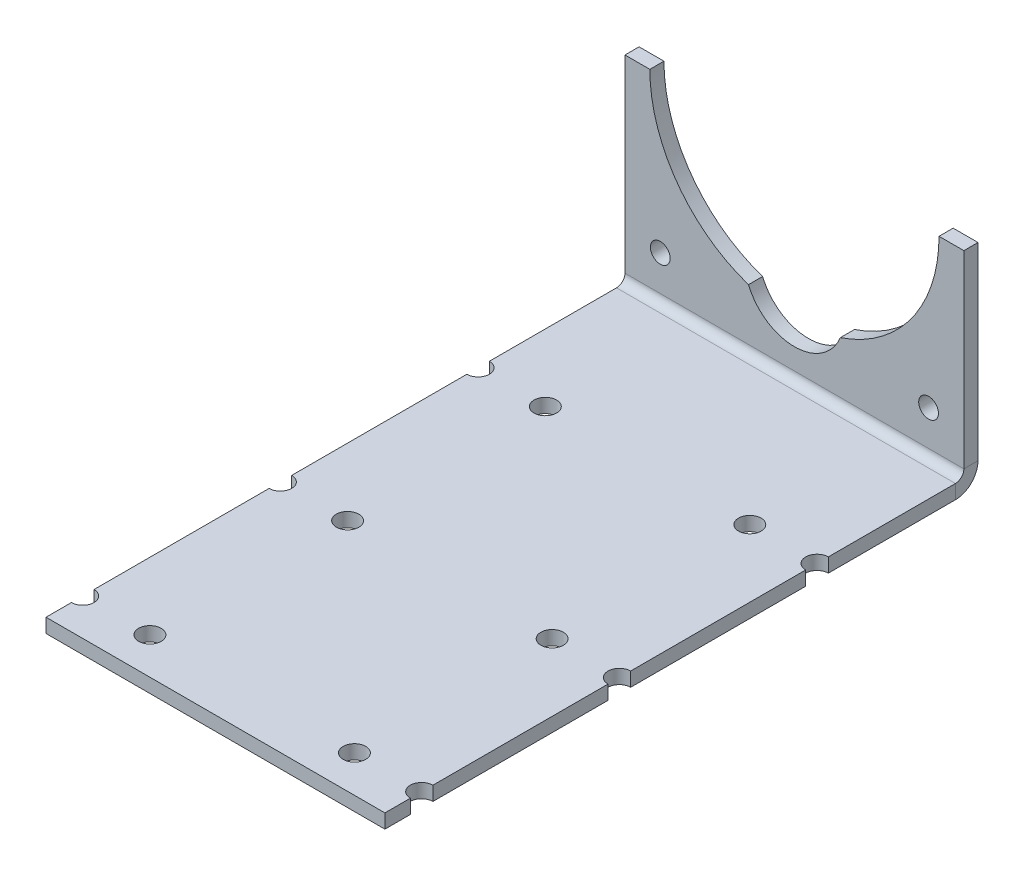
ISO-10303-21;
HEADER;
FILE_DESCRIPTION(('STEP AP214'),'2;1');
FILE_NAME('part.step','',(''),(''),'','','');
FILE_SCHEMA(('AUTOMOTIVE_DESIGN { 1 0 10303 214 1 1 1 1 }'));
ENDSEC;
DATA;
#1=APPLICATION_CONTEXT('core data for automotive mechanical design processes');
#2=APPLICATION_PROTOCOL_DEFINITION('international standard','automotive_design',2000,#1);
#3=PRODUCT_CONTEXT('',#1,'mechanical');
#4=PRODUCT('Part','Part','',(#3));
#5=PRODUCT_RELATED_PRODUCT_CATEGORY('part','',(#4));
#6=PRODUCT_DEFINITION_FORMATION('','',#4);
#7=PRODUCT_DEFINITION_CONTEXT('part definition',#1,'design');
#8=PRODUCT_DEFINITION('design','',#6,#7);
#9=PRODUCT_DEFINITION_SHAPE('','',#8);
#10=(LENGTH_UNIT() NAMED_UNIT(*) SI_UNIT(.MILLI.,.METRE.));
#11=(NAMED_UNIT(*) PLANE_ANGLE_UNIT() SI_UNIT($,.RADIAN.));
#12=(NAMED_UNIT(*) SI_UNIT($,.STERADIAN.) SOLID_ANGLE_UNIT());
#13=UNCERTAINTY_MEASURE_WITH_UNIT(LENGTH_MEASURE(1.E-05),#10,'distance_accuracy_value','');
#14=(GEOMETRIC_REPRESENTATION_CONTEXT(3) GLOBAL_UNCERTAINTY_ASSIGNED_CONTEXT((#13)) GLOBAL_UNIT_ASSIGNED_CONTEXT((#10,
#11,#12)) REPRESENTATION_CONTEXT('',''));
#15=CARTESIAN_POINT('',(0.,0.,0.));
#16=DIRECTION('',(0.,0.,1.));
#17=DIRECTION('',(1.,0.,0.));
#18=AXIS2_PLACEMENT_3D('',#15,#16,#17);
#19=CARTESIAN_POINT('',(60.,-19.74,5.));
#20=DIRECTION('',(-1.,0.,0.));
#21=DIRECTION('',(0.,0.,1.));
#22=AXIS2_PLACEMENT_3D('',#19,#20,#21);
#23=PLANE('',#22);
#24=DIRECTION('',(0.,0.,1.));
#25=VECTOR('',#24,1.);
#26=CARTESIAN_POINT('',(60.,50.1699999999996,5.));
#27=LINE('',#26,#25);
#28=CARTESIAN_POINT('',(60.,50.1699999999996,5.));
#29=VERTEX_POINT('',#28);
#30=CARTESIAN_POINT('',(60.,50.1699999999996,0.));
#31=VERTEX_POINT('',#30);
#32=EDGE_CURVE('E217',#29,#31,#27,.F.);
#33=ORIENTED_EDGE('',*,*,#32,.F.);
#34=DIRECTION('',(0.,1.,0.));
#35=VECTOR('',#34,1.);
#36=CARTESIAN_POINT('',(60.,-19.74,5.));
#37=LINE('',#36,#35);
#38=CARTESIAN_POINT('',(60.,-16.74,5.));
#39=VERTEX_POINT('',#38);
#40=EDGE_CURVE('E224',#39,#29,#37,.T.);
#41=ORIENTED_EDGE('',*,*,#40,.F.);
#42=DIRECTION('',(0.,0.,-1.));
#43=VECTOR('',#42,1.);
#44=CARTESIAN_POINT('',(60.,-16.74,5.));
#45=LINE('',#44,#43);
#46=CARTESIAN_POINT('',(60.,-16.74,0.));
#47=VERTEX_POINT('',#46);
#48=EDGE_CURVE('E291',#39,#47,#45,.T.);
#49=ORIENTED_EDGE('',*,*,#48,.T.);
#50=DIRECTION('',(0.,1.,0.));
#51=VECTOR('',#50,1.);
#52=CARTESIAN_POINT('',(60.,-19.74,0.));
#53=LINE('',#52,#51);
#54=EDGE_CURVE('E225',#47,#31,#53,.T.);
#55=ORIENTED_EDGE('',*,*,#54,.T.);
#56=EDGE_LOOP('',(#33,#41,#49,#55));
#57=FACE_BOUND('',#56,.T.);
#58=ADVANCED_FACE('F42',(#57),#23,.F.);
#59=CARTESIAN_POINT('',(-60.,-19.74,5.));
#60=DIRECTION('',(1.,0.,0.));
#61=DIRECTION('',(0.,0.,-1.));
#62=AXIS2_PLACEMENT_3D('',#59,#60,#61);
#63=PLANE('',#62);
#64=DIRECTION('',(0.,0.,1.));
#65=VECTOR('',#64,1.);
#66=CARTESIAN_POINT('',(-60.,50.17,5.));
#67=LINE('',#66,#65);
#68=CARTESIAN_POINT('',(-60.,50.17,5.));
#69=VERTEX_POINT('',#68);
#70=CARTESIAN_POINT('',(-60.,50.17,0.));
#71=VERTEX_POINT('',#70);
#72=EDGE_CURVE('E202',#69,#71,#67,.F.);
#73=ORIENTED_EDGE('',*,*,#72,.T.);
#74=DIRECTION('',(0.,-1.,0.));
#75=VECTOR('',#74,1.);
#76=CARTESIAN_POINT('',(-60.,-19.74,0.));
#77=LINE('',#76,#75);
#78=CARTESIAN_POINT('',(-60.,-16.74,0.));
#79=VERTEX_POINT('',#78);
#80=EDGE_CURVE('E214',#71,#79,#77,.T.);
#81=ORIENTED_EDGE('',*,*,#80,.T.);
#82=DIRECTION('',(0.,0.,-1.));
#83=VECTOR('',#82,1.);
#84=CARTESIAN_POINT('',(-60.,-16.74,5.));
#85=LINE('',#84,#83);
#86=CARTESIAN_POINT('',(-60.,-16.74,5.));
#87=VERTEX_POINT('',#86);
#88=EDGE_CURVE('E230',#87,#79,#85,.T.);
#89=ORIENTED_EDGE('',*,*,#88,.F.);
#90=DIRECTION('',(0.,-1.,0.));
#91=VECTOR('',#90,1.);
#92=CARTESIAN_POINT('',(-60.,-19.74,5.));
#93=LINE('',#92,#91);
#94=EDGE_CURVE('E216',#69,#87,#93,.T.);
#95=ORIENTED_EDGE('',*,*,#94,.F.);
#96=EDGE_LOOP('',(#73,#81,#89,#95));
#97=FACE_BOUND('',#96,.T.);
#98=ADVANCED_FACE('F212',(#97),#63,.F.);
#99=CARTESIAN_POINT('',(54.,100.5,5.));
#100=DIRECTION('',(0.,0.,1.));
#101=DIRECTION('',(1.,0.,0.));
#102=AXIS2_PLACEMENT_3D('',#99,#100,#101);
#103=PLANE('',#102);
#104=CARTESIAN_POINT('',(47.5,-4.24,5.));
#105=DIRECTION('',(0.,0.,1.));
#106=DIRECTION('',(1.,0.,0.));
#107=AXIS2_PLACEMENT_3D('',#104,#105,#106);
#108=CIRCLE('',#107,3.5);
#109=CARTESIAN_POINT('',(51.,-4.24,5.));
#110=VERTEX_POINT('',#109);
#111=EDGE_CURVE('E503',#110,#110,#108,.T.);
#112=ORIENTED_EDGE('',*,*,#111,.F.);
#113=EDGE_LOOP('',(#112));
#114=FACE_BOUND('',#113,.T.);
#115=CARTESIAN_POINT('',(-47.5,-4.23999999999999,5.));
#116=DIRECTION('',(0.,0.,1.));
#117=DIRECTION('',(1.,0.,0.));
#118=AXIS2_PLACEMENT_3D('',#115,#116,#117);
#119=CIRCLE('',#118,3.5);
#120=CARTESIAN_POINT('',(-44.,-4.23999999999999,5.));
#121=VERTEX_POINT('',#120);
#122=EDGE_CURVE('E511',#121,#121,#119,.T.);
#123=ORIENTED_EDGE('',*,*,#122,.F.);
#124=EDGE_LOOP('',(#123));
#125=FACE_BOUND('',#124,.T.);
#126=ORIENTED_EDGE('',*,*,#40,.T.);
#127=DIRECTION('',(-1.,0.,0.));
#128=VECTOR('',#127,1.);
#129=CARTESIAN_POINT('',(53.9999999999999,50.1699999999996,5.));
#130=LINE('',#129,#128);
#131=CARTESIAN_POINT('',(51.2,50.1699999999996,5.));
#132=VERTEX_POINT('',#131);
#133=EDGE_CURVE('E208',#29,#132,#130,.T.);
#134=ORIENTED_EDGE('',*,*,#133,.T.);
#135=CARTESIAN_POINT('',(0.,50.17,5.));
#136=DIRECTION('',(0.,0.,1.));
#137=DIRECTION('',(1.,0.,0.));
#138=AXIS2_PLACEMENT_3D('',#135,#136,#137);
#139=CIRCLE('',#138,51.2);
#140=CARTESIAN_POINT('',(16.2558406204543,1.61912312097352,5.));
#141=VERTEX_POINT('',#140);
#142=EDGE_CURVE('E492',#141,#132,#139,.T.);
#143=ORIENTED_EDGE('',*,*,#142,.F.);
#144=CARTESIAN_POINT('',(0.,8.26000000000002,5.));
#145=DIRECTION('',(0.,0.,1.));
#146=DIRECTION('',(1.,0.,0.));
#147=AXIS2_PLACEMENT_3D('',#144,#145,#146);
#148=CIRCLE('',#147,17.56);
#149=CARTESIAN_POINT('',(-16.2558406204543,1.6191231209735,5.));
#150=VERTEX_POINT('',#149);
#151=EDGE_CURVE('E500',#150,#141,#148,.T.);
#152=ORIENTED_EDGE('',*,*,#151,.F.);
#153=CARTESIAN_POINT('',(-51.2,50.17,5.));
#154=VERTEX_POINT('',#153);
#155=EDGE_CURVE('E501',#154,#150,#139,.T.);
#156=ORIENTED_EDGE('',*,*,#155,.F.);
#157=DIRECTION('',(-1.,0.,0.));
#158=VECTOR('',#157,1.);
#159=CARTESIAN_POINT('',(54.,50.17,5.));
#160=LINE('',#159,#158);
#161=EDGE_CURVE('E64',#154,#69,#160,.T.);
#162=ORIENTED_EDGE('',*,*,#161,.T.);
#163=ORIENTED_EDGE('',*,*,#94,.T.);
#164=DIRECTION('',(1.,0.,0.));
#165=VECTOR('',#164,1.);
#166=CARTESIAN_POINT('',(60.,-16.74,5.));
#167=LINE('',#166,#165);
#168=EDGE_CURVE('E297',#39,#87,#167,.F.);
#169=ORIENTED_EDGE('',*,*,#168,.F.);
#170=EDGE_LOOP('',(#126,#134,#143,#152,#156,#162,#163,#169));
#171=FACE_BOUND('',#170,.T.);
#172=ADVANCED_FACE('F304',(#114,#125,#171),#103,.T.);
#173=CARTESIAN_POINT('',(54.,100.5,0.));
#174=DIRECTION('',(0.,0.,1.));
#175=DIRECTION('',(1.,0.,0.));
#176=AXIS2_PLACEMENT_3D('',#173,#174,#175);
#177=PLANE('',#176);
#178=CARTESIAN_POINT('',(47.5,-4.24,0.));
#179=DIRECTION('',(0.,0.,-1.));
#180=DIRECTION('',(-1.,0.,0.));
#181=AXIS2_PLACEMENT_3D('',#178,#179,#180);
#182=CIRCLE('',#181,3.5);
#183=CARTESIAN_POINT('',(44.,-4.24,0.));
#184=VERTEX_POINT('',#183);
#185=EDGE_CURVE('E627',#184,#184,#182,.T.);
#186=ORIENTED_EDGE('',*,*,#185,.F.);
#187=EDGE_LOOP('',(#186));
#188=FACE_BOUND('',#187,.T.);
#189=CARTESIAN_POINT('',(-47.5,-4.23999999999999,0.));
#190=DIRECTION('',(0.,0.,-1.));
#191=DIRECTION('',(-1.,0.,0.));
#192=AXIS2_PLACEMENT_3D('',#189,#190,#191);
#193=CIRCLE('',#192,3.5);
#194=CARTESIAN_POINT('',(-51.,-4.23999999999999,0.));
#195=VERTEX_POINT('',#194);
#196=EDGE_CURVE('E631',#195,#195,#193,.T.);
#197=ORIENTED_EDGE('',*,*,#196,.F.);
#198=EDGE_LOOP('',(#197));
#199=FACE_BOUND('',#198,.T.);
#200=DIRECTION('',(1.,0.,0.));
#201=VECTOR('',#200,1.);
#202=CARTESIAN_POINT('',(54.,50.1699999999996,0.));
#203=LINE('',#202,#201);
#204=CARTESIAN_POINT('',(51.2,50.17,0.));
#205=VERTEX_POINT('',#204);
#206=EDGE_CURVE('E56',#31,#205,#203,.F.);
#207=ORIENTED_EDGE('',*,*,#206,.F.);
#208=ORIENTED_EDGE('',*,*,#54,.F.);
#209=DIRECTION('',(1.,0.,0.));
#210=VECTOR('',#209,1.);
#211=CARTESIAN_POINT('',(60.,-16.74,0.));
#212=LINE('',#211,#210);
#213=EDGE_CURVE('E222',#47,#79,#212,.F.);
#214=ORIENTED_EDGE('',*,*,#213,.T.);
#215=ORIENTED_EDGE('',*,*,#80,.F.);
#216=DIRECTION('',(1.,0.,0.));
#217=VECTOR('',#216,1.);
#218=CARTESIAN_POINT('',(54.,50.17,0.));
#219=LINE('',#218,#217);
#220=CARTESIAN_POINT('',(-51.2,50.17,0.));
#221=VERTEX_POINT('',#220);
#222=EDGE_CURVE('E199',#221,#71,#219,.F.);
#223=ORIENTED_EDGE('',*,*,#222,.F.);
#224=CARTESIAN_POINT('',(0.,50.17,0.));
#225=DIRECTION('',(0.,0.,-1.));
#226=DIRECTION('',(-1.,0.,0.));
#227=AXIS2_PLACEMENT_3D('',#224,#225,#226);
#228=CIRCLE('',#227,51.2);
#229=CARTESIAN_POINT('',(-16.2558406204543,1.61912312097351,0.));
#230=VERTEX_POINT('',#229);
#231=EDGE_CURVE('E622',#230,#221,#228,.T.);
#232=ORIENTED_EDGE('',*,*,#231,.F.);
#233=CARTESIAN_POINT('',(0.,8.26000000000002,0.));
#234=DIRECTION('',(0.,0.,-1.));
#235=DIRECTION('',(-1.,0.,0.));
#236=AXIS2_PLACEMENT_3D('',#233,#234,#235);
#237=CIRCLE('',#236,17.56);
#238=CARTESIAN_POINT('',(16.2558406204543,1.61912312097352,0.));
#239=VERTEX_POINT('',#238);
#240=EDGE_CURVE('E630',#239,#230,#237,.T.);
#241=ORIENTED_EDGE('',*,*,#240,.F.);
#242=EDGE_CURVE('E635',#205,#239,#228,.T.);
#243=ORIENTED_EDGE('',*,*,#242,.F.);
#244=EDGE_LOOP('',(#207,#208,#214,#215,#223,#232,#241,#243));
#245=FACE_BOUND('',#244,.T.);
#246=ADVANCED_FACE('F219',(#188,#199,#245),#177,.F.);
#247=CARTESIAN_POINT('',(0.,50.17,10.));
#248=DIRECTION('',(0.,0.,-1.));
#249=DIRECTION('',(-1.,0.,0.));
#250=AXIS2_PLACEMENT_3D('',#247,#248,#249);
#251=CYLINDRICAL_SURFACE('',#250,51.2);
#252=DIRECTION('',(0.,0.,1.));
#253=VECTOR('',#252,1.);
#254=CARTESIAN_POINT('',(51.2,50.1699999999996,5.));
#255=LINE('',#254,#253);
#256=EDGE_CURVE('E486',#132,#205,#255,.F.);
#257=ORIENTED_EDGE('',*,*,#256,.T.);
#258=ORIENTED_EDGE('',*,*,#242,.T.);
#259=DIRECTION('',(0.,0.,-1.));
#260=VECTOR('',#259,1.);
#261=CARTESIAN_POINT('',(16.2558406204543,1.61912312097352,10.));
#262=LINE('',#261,#260);
#263=EDGE_CURVE('E498',#141,#239,#262,.T.);
#264=ORIENTED_EDGE('',*,*,#263,.F.);
#265=ORIENTED_EDGE('',*,*,#142,.T.);
#266=EDGE_LOOP('',(#257,#258,#264,#265));
#267=FACE_BOUND('',#266,.T.);
#268=ADVANCED_FACE('F495',(#267),#251,.F.);
#269=DIRECTION('',(0.,0.,1.));
#270=VECTOR('',#269,1.);
#271=CARTESIAN_POINT('',(-51.2,50.17,5.));
#272=LINE('',#271,#270);
#273=EDGE_CURVE('E203',#154,#221,#272,.F.);
#274=ORIENTED_EDGE('',*,*,#273,.F.);
#275=ORIENTED_EDGE('',*,*,#155,.T.);
#276=DIRECTION('',(0.,0.,-1.));
#277=VECTOR('',#276,1.);
#278=CARTESIAN_POINT('',(-16.2558406204543,1.6191231209735,10.));
#279=LINE('',#278,#277);
#280=EDGE_CURVE('E506',#150,#230,#279,.T.);
#281=ORIENTED_EDGE('',*,*,#280,.T.);
#282=ORIENTED_EDGE('',*,*,#231,.T.);
#283=EDGE_LOOP('',(#274,#275,#281,#282));
#284=FACE_BOUND('',#283,.T.);
#285=ADVANCED_FACE('F601',(#284),#251,.F.);
#286=CARTESIAN_POINT('',(60.,-24.7400000000007,210.));
#287=DIRECTION('',(-1.,0.,0.));
#288=DIRECTION('',(0.,0.,1.));
#289=AXIS2_PLACEMENT_3D('',#286,#287,#288);
#290=PLANE('',#289);
#291=DIRECTION('',(0.,0.,1.));
#292=VECTOR('',#291,1.);
#293=CARTESIAN_POINT('',(60.,-24.7400000000007,210.));
#294=LINE('',#293,#292);
#295=CARTESIAN_POINT('',(60.,-24.7400000000007,200.999999999999));
#296=VERTEX_POINT('',#295);
#297=CARTESIAN_POINT('',(60.,-24.7400000000007,210.));
#298=VERTEX_POINT('',#297);
#299=EDGE_CURVE('E277',#296,#298,#294,.T.);
#300=ORIENTED_EDGE('',*,*,#299,.F.);
#301=DIRECTION('',(0.,1.,0.));
#302=VECTOR('',#301,1.);
#303=CARTESIAN_POINT('',(60.,-29.7400000000007,200.999999999999));
#304=LINE('',#303,#302);
#305=CARTESIAN_POINT('',(60.,-19.7400000000007,200.999999999999));
#306=VERTEX_POINT('',#305);
#307=EDGE_CURVE('E326',#296,#306,#304,.T.);
#308=ORIENTED_EDGE('',*,*,#307,.T.);
#309=DIRECTION('',(0.,0.,1.));
#310=VECTOR('',#309,1.);
#311=CARTESIAN_POINT('',(60.,-19.7400000000007,210.));
#312=LINE('',#311,#310);
#313=CARTESIAN_POINT('',(60.,-19.7400000000007,210.));
#314=VERTEX_POINT('',#313);
#315=EDGE_CURVE('E262',#306,#314,#312,.T.);
#316=ORIENTED_EDGE('',*,*,#315,.T.);
#317=DIRECTION('',(0.,1.,0.));
#318=VECTOR('',#317,1.);
#319=CARTESIAN_POINT('',(60.,-24.7400000000007,210.));
#320=LINE('',#319,#318);
#321=EDGE_CURVE('E282',#298,#314,#320,.T.);
#322=ORIENTED_EDGE('',*,*,#321,.F.);
#323=EDGE_LOOP('',(#300,#308,#316,#322));
#324=FACE_BOUND('',#323,.T.);
#325=ADVANCED_FACE('F400',(#324),#290,.F.);
#326=CARTESIAN_POINT('',(60.,-19.7400000000004,130.999999999999));
#327=VERTEX_POINT('',#326);
#328=CARTESIAN_POINT('',(60.,-19.7400000000006,193.));
#329=VERTEX_POINT('',#328);
#330=EDGE_CURVE('E252',#327,#329,#312,.T.);
#331=ORIENTED_EDGE('',*,*,#330,.T.);
#332=DIRECTION('',(0.,1.,0.));
#333=VECTOR('',#332,1.);
#334=CARTESIAN_POINT('',(60.,-29.7400000000006,193.));
#335=LINE('',#334,#333);
#336=CARTESIAN_POINT('',(60.,-24.7400000000006,193.));
#337=VERTEX_POINT('',#336);
#338=EDGE_CURVE('E395',#329,#337,#335,.F.);
#339=ORIENTED_EDGE('',*,*,#338,.T.);
#340=CARTESIAN_POINT('',(60.,-24.7400000000004,130.999999999999));
#341=VERTEX_POINT('',#340);
#342=EDGE_CURVE('E254',#341,#337,#294,.T.);
#343=ORIENTED_EDGE('',*,*,#342,.F.);
#344=DIRECTION('',(0.,1.,0.));
#345=VECTOR('',#344,1.);
#346=CARTESIAN_POINT('',(60.,-29.7400000000004,130.999999999999));
#347=LINE('',#346,#345);
#348=EDGE_CURVE('E239',#341,#327,#347,.T.);
#349=ORIENTED_EDGE('',*,*,#348,.T.);
#350=EDGE_LOOP('',(#331,#339,#343,#349));
#351=FACE_BOUND('',#350,.T.);
#352=ADVANCED_FACE('F250',(#351),#290,.F.);
#353=CARTESIAN_POINT('',(60.,-19.7400000000002,60.9999999999992));
#354=VERTEX_POINT('',#353);
#355=CARTESIAN_POINT('',(60.,-19.7400000000004,123.));
#356=VERTEX_POINT('',#355);
#357=EDGE_CURVE('E261',#354,#356,#312,.T.);
#358=ORIENTED_EDGE('',*,*,#357,.T.);
#359=DIRECTION('',(0.,1.,0.));
#360=VECTOR('',#359,1.);
#361=CARTESIAN_POINT('',(60.,-29.7400000000004,123.));
#362=LINE('',#361,#360);
#363=CARTESIAN_POINT('',(60.,-24.7400000000004,123.));
#364=VERTEX_POINT('',#363);
#365=EDGE_CURVE('E242',#356,#364,#362,.F.);
#366=ORIENTED_EDGE('',*,*,#365,.T.);
#367=CARTESIAN_POINT('',(60.,-24.7400000000002,60.9999999999992));
#368=VERTEX_POINT('',#367);
#369=EDGE_CURVE('E335',#368,#364,#294,.T.);
#370=ORIENTED_EDGE('',*,*,#369,.F.);
#371=DIRECTION('',(0.,1.,0.));
#372=VECTOR('',#371,1.);
#373=CARTESIAN_POINT('',(60.,-29.7400000000002,60.9999999999992));
#374=LINE('',#373,#372);
#375=EDGE_CURVE('E446',#368,#354,#374,.T.);
#376=ORIENTED_EDGE('',*,*,#375,.T.);
#377=EDGE_LOOP('',(#358,#366,#370,#376));
#378=FACE_BOUND('',#377,.T.);
#379=ADVANCED_FACE('F544',(#378),#290,.F.);
#380=CARTESIAN_POINT('',(-60.,-24.74,4.99999999999998));
#381=DIRECTION('',(1.,0.,0.));
#382=DIRECTION('',(0.,0.,-1.));
#383=AXIS2_PLACEMENT_3D('',#380,#381,#382);
#384=PLANE('',#383);
#385=DIRECTION('',(0.,0.,-1.));
#386=VECTOR('',#385,1.);
#387=CARTESIAN_POINT('',(-60.,-24.74,4.99999999999998));
#388=LINE('',#387,#386);
#389=CARTESIAN_POINT('',(-60.,-24.7400000000006,193.000000000001));
#390=VERTEX_POINT('',#389);
#391=CARTESIAN_POINT('',(-60.,-24.7400000000004,131.000000000001));
#392=VERTEX_POINT('',#391);
#393=EDGE_CURVE('E345',#390,#392,#388,.T.);
#394=ORIENTED_EDGE('',*,*,#393,.F.);
#395=DIRECTION('',(0.,1.,0.));
#396=VECTOR('',#395,1.);
#397=CARTESIAN_POINT('',(-60.,-29.7400000000006,193.000000000001));
#398=LINE('',#397,#396);
#399=CARTESIAN_POINT('',(-60.,-19.7400000000006,193.000000000001));
#400=VERTEX_POINT('',#399);
#401=EDGE_CURVE('E360',#390,#400,#398,.T.);
#402=ORIENTED_EDGE('',*,*,#401,.T.);
#403=DIRECTION('',(0.,0.,-1.));
#404=VECTOR('',#403,1.);
#405=CARTESIAN_POINT('',(-60.,-19.74,5.));
#406=LINE('',#405,#404);
#407=CARTESIAN_POINT('',(-60.,-19.7400000000004,131.000000000001));
#408=VERTEX_POINT('',#407);
#409=EDGE_CURVE('E278',#400,#408,#406,.T.);
#410=ORIENTED_EDGE('',*,*,#409,.T.);
#411=DIRECTION('',(0.,1.,0.));
#412=VECTOR('',#411,1.);
#413=CARTESIAN_POINT('',(-60.,-29.7400000000004,131.000000000001));
#414=LINE('',#413,#412);
#415=EDGE_CURVE('E362',#408,#392,#414,.F.);
#416=ORIENTED_EDGE('',*,*,#415,.T.);
#417=EDGE_LOOP('',(#394,#402,#410,#416));
#418=FACE_BOUND('',#417,.T.);
#419=ADVANCED_FACE('F358',(#418),#384,.F.);
#420=CARTESIAN_POINT('',(-60.,-24.7400000000004,123.000000000001));
#421=VERTEX_POINT('',#420);
#422=CARTESIAN_POINT('',(-60.,-24.7400000000002,61.0000000000007));
#423=VERTEX_POINT('',#422);
#424=EDGE_CURVE('E341',#421,#423,#388,.T.);
#425=ORIENTED_EDGE('',*,*,#424,.F.);
#426=DIRECTION('',(0.,1.,0.));
#427=VECTOR('',#426,1.);
#428=CARTESIAN_POINT('',(-60.,-29.7400000000004,123.000000000001));
#429=LINE('',#428,#427);
#430=CARTESIAN_POINT('',(-60.,-19.7400000000004,123.000000000001));
#431=VERTEX_POINT('',#430);
#432=EDGE_CURVE('E365',#421,#431,#429,.T.);
#433=ORIENTED_EDGE('',*,*,#432,.T.);
#434=CARTESIAN_POINT('',(-60.,-19.7400000000002,61.0000000000007));
#435=VERTEX_POINT('',#434);
#436=EDGE_CURVE('E461',#431,#435,#406,.T.);
#437=ORIENTED_EDGE('',*,*,#436,.T.);
#438=DIRECTION('',(0.,1.,0.));
#439=VECTOR('',#438,1.);
#440=CARTESIAN_POINT('',(-60.,-29.7400000000002,61.0000000000007));
#441=LINE('',#440,#439);
#442=EDGE_CURVE('E451',#435,#423,#441,.F.);
#443=ORIENTED_EDGE('',*,*,#442,.T.);
#444=EDGE_LOOP('',(#425,#433,#437,#443));
#445=FACE_BOUND('',#444,.T.);
#446=ADVANCED_FACE('F463',(#445),#384,.F.);
#447=CARTESIAN_POINT('',(-60.,-24.7400000000002,53.0000000000014));
#448=VERTEX_POINT('',#447);
#449=CARTESIAN_POINT('',(-60.,-24.74,7.99999999999997));
#450=VERTEX_POINT('',#449);
#451=EDGE_CURVE('E336',#448,#450,#388,.T.);
#452=ORIENTED_EDGE('',*,*,#451,.F.);
#453=DIRECTION('',(0.,1.,0.));
#454=VECTOR('',#453,1.);
#455=CARTESIAN_POINT('',(-60.,-29.7400000000002,53.0000000000014));
#456=LINE('',#455,#454);
#457=CARTESIAN_POINT('',(-60.,-19.7400000000002,53.0000000000014));
#458=VERTEX_POINT('',#457);
#459=EDGE_CURVE('E370',#448,#458,#456,.T.);
#460=ORIENTED_EDGE('',*,*,#459,.T.);
#461=CARTESIAN_POINT('',(-60.,-19.74,7.99999999999999));
#462=VERTEX_POINT('',#461);
#463=EDGE_CURVE('E273',#458,#462,#406,.T.);
#464=ORIENTED_EDGE('',*,*,#463,.T.);
#465=DIRECTION('',(0.,-1.,0.));
#466=VECTOR('',#465,1.);
#467=CARTESIAN_POINT('',(-60.,-19.74,7.99999999999999));
#468=LINE('',#467,#466);
#469=EDGE_CURVE('E317',#462,#450,#468,.T.);
#470=ORIENTED_EDGE('',*,*,#469,.T.);
#471=EDGE_LOOP('',(#452,#460,#464,#470));
#472=FACE_BOUND('',#471,.T.);
#473=ADVANCED_FACE('F455',(#472),#384,.F.);
#474=CARTESIAN_POINT('',(-60.,-16.74,8.));
#475=DIRECTION('',(-1.,0.,0.));
#476=DIRECTION('',(0.,0.,1.));
#477=AXIS2_PLACEMENT_3D('',#474,#475,#476);
#478=PLANE('',#477);
#479=ORIENTED_EDGE('',*,*,#469,.F.);
#480=CARTESIAN_POINT('',(-60.,-16.74,8.));
#481=DIRECTION('',(1.,0.,0.));
#482=DIRECTION('',(0.,0.,-1.));
#483=AXIS2_PLACEMENT_3D('',#480,#481,#482);
#484=CIRCLE('',#483,3.);
#485=EDGE_CURVE('E294',#87,#462,#484,.F.);
#486=ORIENTED_EDGE('',*,*,#485,.F.);
#487=ORIENTED_EDGE('',*,*,#88,.T.);
#488=CARTESIAN_POINT('',(-60.,-16.74,8.));
#489=DIRECTION('',(1.,0.,0.));
#490=DIRECTION('',(0.,0.,-1.));
#491=AXIS2_PLACEMENT_3D('',#488,#489,#490);
#492=CIRCLE('',#491,8.);
#493=EDGE_CURVE('E287',#79,#450,#492,.F.);
#494=ORIENTED_EDGE('',*,*,#493,.T.);
#495=EDGE_LOOP('',(#479,#486,#487,#494));
#496=FACE_BOUND('',#495,.T.);
#497=ADVANCED_FACE('F315',(#496),#478,.T.);
#498=CARTESIAN_POINT('',(60.,-16.74,8.));
#499=DIRECTION('',(-1.,0.,0.));
#500=DIRECTION('',(0.,0.,1.));
#501=AXIS2_PLACEMENT_3D('',#498,#499,#500);
#502=PLANE('',#501);
#503=CARTESIAN_POINT('',(60.,-16.74,8.));
#504=DIRECTION('',(1.,0.,0.));
#505=DIRECTION('',(0.,0.,-1.));
#506=AXIS2_PLACEMENT_3D('',#503,#504,#505);
#507=CIRCLE('',#506,3.);
#508=CARTESIAN_POINT('',(60.,-19.74,7.99999999999999));
#509=VERTEX_POINT('',#508);
#510=EDGE_CURVE('E285',#509,#39,#507,.T.);
#511=ORIENTED_EDGE('',*,*,#510,.F.);
#512=DIRECTION('',(0.,-1.,0.));
#513=VECTOR('',#512,1.);
#514=CARTESIAN_POINT('',(60.,-19.74,7.99999999999999));
#515=LINE('',#514,#513);
#516=CARTESIAN_POINT('',(60.,-24.74,7.99999999999997));
#517=VERTEX_POINT('',#516);
#518=EDGE_CURVE('E323',#509,#517,#515,.T.);
#519=ORIENTED_EDGE('',*,*,#518,.T.);
#520=CARTESIAN_POINT('',(60.,-16.74,8.));
#521=DIRECTION('',(1.,0.,0.));
#522=DIRECTION('',(0.,0.,-1.));
#523=AXIS2_PLACEMENT_3D('',#520,#521,#522);
#524=CIRCLE('',#523,8.);
#525=EDGE_CURVE('E288',#517,#47,#524,.T.);
#526=ORIENTED_EDGE('',*,*,#525,.T.);
#527=ORIENTED_EDGE('',*,*,#48,.F.);
#528=EDGE_LOOP('',(#511,#519,#526,#527));
#529=FACE_BOUND('',#528,.T.);
#530=ADVANCED_FACE('F528',(#529),#502,.F.);
#531=CARTESIAN_POINT('',(60.,-16.74,8.));
#532=DIRECTION('',(1.,0.,0.));
#533=DIRECTION('',(0.,-1.,0.));
#534=AXIS2_PLACEMENT_3D('',#531,#532,#533);
#535=CYLINDRICAL_SURFACE('',#534,8.);
#536=ORIENTED_EDGE('',*,*,#213,.F.);
#537=ORIENTED_EDGE('',*,*,#525,.F.);
#538=DIRECTION('',(-1.,0.,0.));
#539=VECTOR('',#538,1.);
#540=CARTESIAN_POINT('',(0.,-24.74,7.99999999999997));
#541=LINE('',#540,#539);
#542=EDGE_CURVE('E265',#517,#450,#541,.T.);
#543=ORIENTED_EDGE('',*,*,#542,.T.);
#544=ORIENTED_EDGE('',*,*,#493,.F.);
#545=EDGE_LOOP('',(#536,#537,#543,#544));
#546=FACE_BOUND('',#545,.T.);
#547=ADVANCED_FACE('F531',(#546),#535,.T.);
#548=CARTESIAN_POINT('',(60.,-16.74,8.));
#549=DIRECTION('',(1.,0.,0.));
#550=DIRECTION('',(0.,-1.,0.));
#551=AXIS2_PLACEMENT_3D('',#548,#549,#550);
#552=CYLINDRICAL_SURFACE('',#551,3.);
#553=ORIENTED_EDGE('',*,*,#168,.T.);
#554=ORIENTED_EDGE('',*,*,#485,.T.);
#555=DIRECTION('',(1.,0.,0.));
#556=VECTOR('',#555,1.);
#557=CARTESIAN_POINT('',(-60.,-19.74,7.99999999999999));
#558=LINE('',#557,#556);
#559=EDGE_CURVE('E320',#462,#509,#558,.T.);
#560=ORIENTED_EDGE('',*,*,#559,.T.);
#561=ORIENTED_EDGE('',*,*,#510,.T.);
#562=EDGE_LOOP('',(#553,#554,#560,#561));
#563=FACE_BOUND('',#562,.T.);
#564=ADVANCED_FACE('F311',(#563),#552,.F.);
#565=CARTESIAN_POINT('',(60.,-19.7400000000002,52.9999999999999));
#566=VERTEX_POINT('',#565);
#567=EDGE_CURVE('E264',#509,#566,#312,.T.);
#568=ORIENTED_EDGE('',*,*,#567,.T.);
#569=DIRECTION('',(0.,1.,0.));
#570=VECTOR('',#569,1.);
#571=CARTESIAN_POINT('',(60.,-29.7400000000002,52.9999999999999));
#572=LINE('',#571,#570);
#573=CARTESIAN_POINT('',(60.,-24.7400000000002,52.9999999999999));
#574=VERTEX_POINT('',#573);
#575=EDGE_CURVE('E443',#566,#574,#572,.F.);
#576=ORIENTED_EDGE('',*,*,#575,.T.);
#577=EDGE_CURVE('E332',#517,#574,#294,.T.);
#578=ORIENTED_EDGE('',*,*,#577,.F.);
#579=ORIENTED_EDGE('',*,*,#518,.F.);
#580=EDGE_LOOP('',(#568,#576,#578,#579));
#581=FACE_BOUND('',#580,.T.);
#582=ADVANCED_FACE('F537',(#581),#290,.F.);
#583=CARTESIAN_POINT('',(-60.,-19.7400000000007,210.));
#584=VERTEX_POINT('',#583);
#585=CARTESIAN_POINT('',(-60.,-19.7400000000007,201.000000000001));
#586=VERTEX_POINT('',#585);
#587=EDGE_CURVE('E274',#584,#586,#406,.T.);
#588=ORIENTED_EDGE('',*,*,#587,.T.);
#589=DIRECTION('',(0.,1.,0.));
#590=VECTOR('',#589,1.);
#591=CARTESIAN_POINT('',(-60.,-29.7400000000007,201.000000000001));
#592=LINE('',#591,#590);
#593=CARTESIAN_POINT('',(-60.,-24.7400000000007,201.000000000001));
#594=VERTEX_POINT('',#593);
#595=EDGE_CURVE('E386',#586,#594,#592,.F.);
#596=ORIENTED_EDGE('',*,*,#595,.T.);
#597=CARTESIAN_POINT('',(-60.,-24.7400000000007,210.));
#598=VERTEX_POINT('',#597);
#599=EDGE_CURVE('E270',#598,#594,#388,.T.);
#600=ORIENTED_EDGE('',*,*,#599,.F.);
#601=DIRECTION('',(0.,1.,0.));
#602=VECTOR('',#601,1.);
#603=CARTESIAN_POINT('',(-60.,-24.7400000000007,210.));
#604=LINE('',#603,#602);
#605=EDGE_CURVE('E279',#598,#584,#604,.T.);
#606=ORIENTED_EDGE('',*,*,#605,.T.);
#607=EDGE_LOOP('',(#588,#596,#600,#606));
#608=FACE_BOUND('',#607,.T.);
#609=ADVANCED_FACE('F409',(#608),#384,.F.);
#610=CARTESIAN_POINT('',(0.,-24.74,0.));
#611=DIRECTION('',(0.,1.,0.));
#612=DIRECTION('',(0.,0.,1.));
#613=AXIS2_PLACEMENT_3D('',#610,#611,#612);
#614=PLANE('',#613);
#615=CARTESIAN_POINT('',(-36.2050000000002,-24.7400000000002,57.000000000001));
#616=DIRECTION('',(0.,1.,0.));
#617=DIRECTION('',(0.,0.,1.));
#618=AXIS2_PLACEMENT_3D('',#615,#616,#617);
#619=CIRCLE('',#618,4.00000000000001);
#620=CARTESIAN_POINT('',(-36.2050000000002,-24.7400000000002,61.000000000001));
#621=VERTEX_POINT('',#620);
#622=EDGE_CURVE('E321',#621,#621,#619,.T.);
#623=ORIENTED_EDGE('',*,*,#622,.T.);
#624=EDGE_LOOP('',(#623));
#625=FACE_BOUND('',#624,.T.);
#626=CARTESIAN_POINT('',(36.2049999999998,-24.7400000000002,56.9999999999997));
#627=DIRECTION('',(0.,1.,0.));
#628=DIRECTION('',(0.,0.,1.));
#629=AXIS2_PLACEMENT_3D('',#626,#627,#628);
#630=CIRCLE('',#629,4.00000000000001);
#631=CARTESIAN_POINT('',(36.2049999999998,-24.7400000000002,60.9999999999997));
#632=VERTEX_POINT('',#631);
#633=EDGE_CURVE('E382',#632,#632,#630,.T.);
#634=ORIENTED_EDGE('',*,*,#633,.T.);
#635=EDGE_LOOP('',(#634));
#636=FACE_BOUND('',#635,.T.);
#637=CARTESIAN_POINT('',(36.2050000000004,-24.7400000000004,127.));
#638=DIRECTION('',(0.,1.,0.));
#639=DIRECTION('',(0.,0.,1.));
#640=AXIS2_PLACEMENT_3D('',#637,#638,#639);
#641=CIRCLE('',#640,4.00000000000001);
#642=CARTESIAN_POINT('',(36.2050000000004,-24.7400000000004,131.));
#643=VERTEX_POINT('',#642);
#644=EDGE_CURVE('E379',#643,#643,#641,.T.);
#645=ORIENTED_EDGE('',*,*,#644,.T.);
#646=EDGE_LOOP('',(#645));
#647=FACE_BOUND('',#646,.T.);
#648=CARTESIAN_POINT('',(-36.2049999999998,-24.7400000000004,127.000000000001));
#649=DIRECTION('',(0.,1.,0.));
#650=DIRECTION('',(0.,0.,1.));
#651=AXIS2_PLACEMENT_3D('',#648,#649,#650);
#652=CIRCLE('',#651,4.00000000000001);
#653=CARTESIAN_POINT('',(-36.2049999999998,-24.7400000000004,131.000000000001));
#654=VERTEX_POINT('',#653);
#655=EDGE_CURVE('E376',#654,#654,#652,.T.);
#656=ORIENTED_EDGE('',*,*,#655,.T.);
#657=EDGE_LOOP('',(#656));
#658=FACE_BOUND('',#657,.T.);
#659=CARTESIAN_POINT('',(-36.2049999999994,-24.7400000000007,197.000000000001));
#660=DIRECTION('',(0.,1.,0.));
#661=DIRECTION('',(0.,0.,1.));
#662=AXIS2_PLACEMENT_3D('',#659,#660,#661);
#663=CIRCLE('',#662,4.00000000000004);
#664=CARTESIAN_POINT('',(-36.2049999999994,-24.7400000000007,201.000000000001));
#665=VERTEX_POINT('',#664);
#666=EDGE_CURVE('E368',#665,#665,#663,.T.);
#667=ORIENTED_EDGE('',*,*,#666,.T.);
#668=EDGE_LOOP('',(#667));
#669=FACE_BOUND('',#668,.T.);
#670=CARTESIAN_POINT('',(36.2050000000008,-24.7400000000007,197.));
#671=DIRECTION('',(0.,1.,0.));
#672=DIRECTION('',(0.,0.,1.));
#673=AXIS2_PLACEMENT_3D('',#670,#671,#672);
#674=CIRCLE('',#673,3.99999999999999);
#675=CARTESIAN_POINT('',(36.2050000000008,-24.7400000000007,201.));
#676=VERTEX_POINT('',#675);
#677=EDGE_CURVE('E437',#676,#676,#674,.T.);
#678=ORIENTED_EDGE('',*,*,#677,.T.);
#679=EDGE_LOOP('',(#678));
#680=FACE_BOUND('',#679,.T.);
#681=ORIENTED_EDGE('',*,*,#342,.T.);
#682=CARTESIAN_POINT('',(60.0000000000004,-24.7400000000007,197.));
#683=DIRECTION('',(0.,1.,0.));
#684=DIRECTION('',(0.,0.,1.));
#685=AXIS2_PLACEMENT_3D('',#682,#683,#684);
#686=CIRCLE('',#685,3.99999999999962);
#687=EDGE_CURVE('E255',#337,#296,#686,.T.);
#688=ORIENTED_EDGE('',*,*,#687,.T.);
#689=ORIENTED_EDGE('',*,*,#299,.T.);
#690=DIRECTION('',(-1.,0.,0.));
#691=VECTOR('',#690,1.);
#692=CARTESIAN_POINT('',(-60.,-24.7400000000007,210.));
#693=LINE('',#692,#691);
#694=EDGE_CURVE('E334',#298,#598,#693,.T.);
#695=ORIENTED_EDGE('',*,*,#694,.T.);
#696=ORIENTED_EDGE('',*,*,#599,.T.);
#697=CARTESIAN_POINT('',(-59.9999999999996,-24.7400000000007,197.000000000001));
#698=DIRECTION('',(0.,1.,0.));
#699=DIRECTION('',(0.,0.,1.));
#700=AXIS2_PLACEMENT_3D('',#697,#698,#699);
#701=CIRCLE('',#700,3.99999999999962);
#702=EDGE_CURVE('E354',#594,#390,#701,.T.);
#703=ORIENTED_EDGE('',*,*,#702,.T.);
#704=ORIENTED_EDGE('',*,*,#393,.T.);
#705=CARTESIAN_POINT('',(-60.,-24.7400000000004,127.000000000001));
#706=DIRECTION('',(0.,1.,0.));
#707=DIRECTION('',(0.,0.,1.));
#708=AXIS2_PLACEMENT_3D('',#705,#706,#707);
#709=CIRCLE('',#708,3.99999999999964);
#710=EDGE_CURVE('E352',#392,#421,#709,.T.);
#711=ORIENTED_EDGE('',*,*,#710,.T.);
#712=ORIENTED_EDGE('',*,*,#424,.T.);
#713=CARTESIAN_POINT('',(-60.,-24.7400000000002,57.000000000001));
#714=DIRECTION('',(0.,1.,0.));
#715=DIRECTION('',(0.,0.,1.));
#716=AXIS2_PLACEMENT_3D('',#713,#714,#715);
#717=CIRCLE('',#716,3.99999999999964);
#718=EDGE_CURVE('E449',#423,#448,#717,.T.);
#719=ORIENTED_EDGE('',*,*,#718,.T.);
#720=ORIENTED_EDGE('',*,*,#451,.T.);
#721=ORIENTED_EDGE('',*,*,#542,.F.);
#722=ORIENTED_EDGE('',*,*,#577,.T.);
#723=CARTESIAN_POINT('',(60.,-24.7400000000002,56.9999999999995));
#724=DIRECTION('',(0.,1.,0.));
#725=DIRECTION('',(0.,0.,1.));
#726=AXIS2_PLACEMENT_3D('',#723,#724,#725);
#727=CIRCLE('',#726,3.99999999999964);
#728=EDGE_CURVE('E440',#574,#368,#727,.T.);
#729=ORIENTED_EDGE('',*,*,#728,.T.);
#730=ORIENTED_EDGE('',*,*,#369,.T.);
#731=CARTESIAN_POINT('',(60.,-24.7400000000004,127.));
#732=DIRECTION('',(0.,1.,0.));
#733=DIRECTION('',(0.,0.,1.));
#734=AXIS2_PLACEMENT_3D('',#731,#732,#733);
#735=CIRCLE('',#734,3.99999999999963);
#736=EDGE_CURVE('E390',#364,#341,#735,.T.);
#737=ORIENTED_EDGE('',*,*,#736,.T.);
#738=EDGE_LOOP('',(#681,#688,#689,#695,#696,#703,#704,#711,#712,#719,#720,#721,#722,#729,#730,#737));
#739=FACE_BOUND('',#738,.T.);
#740=ADVANCED_FACE('F351',(#625,#636,#647,#658,#669,#680,#739),#614,.F.);
#741=CARTESIAN_POINT('',(0.,-19.74,0.));
#742=DIRECTION('',(0.,1.,0.));
#743=DIRECTION('',(0.,0.,1.));
#744=AXIS2_PLACEMENT_3D('',#741,#742,#743);
#745=PLANE('',#744);
#746=CARTESIAN_POINT('',(-36.2050000000002,-19.7400000000002,57.0000000000011));
#747=DIRECTION('',(0.,1.,0.));
#748=DIRECTION('',(0.,0.,1.));
#749=AXIS2_PLACEMENT_3D('',#746,#747,#748);
#750=CIRCLE('',#749,4.00000000000001);
#751=CARTESIAN_POINT('',(-36.2050000000002,-19.7400000000002,61.0000000000011));
#752=VERTEX_POINT('',#751);
#753=EDGE_CURVE('E413',#752,#752,#750,.T.);
#754=ORIENTED_EDGE('',*,*,#753,.F.);
#755=EDGE_LOOP('',(#754));
#756=FACE_BOUND('',#755,.T.);
#757=CARTESIAN_POINT('',(60.0000000000004,-19.7400000000007,197.));
#758=DIRECTION('',(0.,1.,0.));
#759=DIRECTION('',(0.,0.,1.));
#760=AXIS2_PLACEMENT_3D('',#757,#758,#759);
#761=CIRCLE('',#760,3.99999999999962);
#762=EDGE_CURVE('E11',#329,#306,#761,.T.);
#763=ORIENTED_EDGE('',*,*,#762,.F.);
#764=ORIENTED_EDGE('',*,*,#330,.F.);
#765=CARTESIAN_POINT('',(60.,-19.7400000000004,127.));
#766=DIRECTION('',(0.,1.,0.));
#767=DIRECTION('',(0.,0.,1.));
#768=AXIS2_PLACEMENT_3D('',#765,#766,#767);
#769=CIRCLE('',#768,3.99999999999963);
#770=EDGE_CURVE('E49',#356,#327,#769,.T.);
#771=ORIENTED_EDGE('',*,*,#770,.F.);
#772=ORIENTED_EDGE('',*,*,#357,.F.);
#773=CARTESIAN_POINT('',(60.,-19.7400000000002,56.9999999999996));
#774=DIRECTION('',(0.,1.,0.));
#775=DIRECTION('',(0.,0.,1.));
#776=AXIS2_PLACEMENT_3D('',#773,#774,#775);
#777=CIRCLE('',#776,3.99999999999964);
#778=EDGE_CURVE('E234',#566,#354,#777,.T.);
#779=ORIENTED_EDGE('',*,*,#778,.F.);
#780=ORIENTED_EDGE('',*,*,#567,.F.);
#781=ORIENTED_EDGE('',*,*,#559,.F.);
#782=ORIENTED_EDGE('',*,*,#463,.F.);
#783=CARTESIAN_POINT('',(-60.,-19.7400000000002,57.0000000000011));
#784=DIRECTION('',(0.,1.,0.));
#785=DIRECTION('',(0.,0.,1.));
#786=AXIS2_PLACEMENT_3D('',#783,#784,#785);
#787=CIRCLE('',#786,3.99999999999964);
#788=EDGE_CURVE('E419',#435,#458,#787,.T.);
#789=ORIENTED_EDGE('',*,*,#788,.F.);
#790=ORIENTED_EDGE('',*,*,#436,.F.);
#791=CARTESIAN_POINT('',(-60.,-19.7400000000004,127.000000000001));
#792=DIRECTION('',(0.,1.,0.));
#793=DIRECTION('',(0.,0.,1.));
#794=AXIS2_PLACEMENT_3D('',#791,#792,#793);
#795=CIRCLE('',#794,3.99999999999964);
#796=EDGE_CURVE('E414',#408,#431,#795,.T.);
#797=ORIENTED_EDGE('',*,*,#796,.F.);
#798=ORIENTED_EDGE('',*,*,#409,.F.);
#799=CARTESIAN_POINT('',(-59.9999999999996,-19.7400000000007,197.000000000001));
#800=DIRECTION('',(0.,1.,0.));
#801=DIRECTION('',(0.,0.,1.));
#802=AXIS2_PLACEMENT_3D('',#799,#800,#801);
#803=CIRCLE('',#802,3.99999999999962);
#804=EDGE_CURVE('E412',#586,#400,#803,.T.);
#805=ORIENTED_EDGE('',*,*,#804,.F.);
#806=ORIENTED_EDGE('',*,*,#587,.F.);
#807=DIRECTION('',(-1.,0.,0.));
#808=VECTOR('',#807,1.);
#809=CARTESIAN_POINT('',(-60.,-19.7400000000007,210.));
#810=LINE('',#809,#808);
#811=EDGE_CURVE('E269',#314,#584,#810,.T.);
#812=ORIENTED_EDGE('',*,*,#811,.F.);
#813=ORIENTED_EDGE('',*,*,#315,.F.);
#814=EDGE_LOOP('',(#763,#764,#771,#772,#779,#780,#781,#782,#789,#790,#797,#798,#805,#806,#812,#813));
#815=FACE_BOUND('',#814,.T.);
#816=CARTESIAN_POINT('',(36.2049999999998,-19.7400000000002,56.9999999999997));
#817=DIRECTION('',(0.,1.,0.));
#818=DIRECTION('',(0.,0.,1.));
#819=AXIS2_PLACEMENT_3D('',#816,#817,#818);
#820=CIRCLE('',#819,4.00000000000001);
#821=CARTESIAN_POINT('',(36.2049999999998,-19.7400000000002,60.9999999999997));
#822=VERTEX_POINT('',#821);
#823=EDGE_CURVE('E417',#822,#822,#820,.T.);
#824=ORIENTED_EDGE('',*,*,#823,.F.);
#825=EDGE_LOOP('',(#824));
#826=FACE_BOUND('',#825,.T.);
#827=CARTESIAN_POINT('',(36.2050000000004,-19.7400000000004,127.));
#828=DIRECTION('',(0.,1.,0.));
#829=DIRECTION('',(0.,0.,1.));
#830=AXIS2_PLACEMENT_3D('',#827,#828,#829);
#831=CIRCLE('',#830,4.00000000000001);
#832=CARTESIAN_POINT('',(36.2050000000004,-19.7400000000004,131.));
#833=VERTEX_POINT('',#832);
#834=EDGE_CURVE('E430',#833,#833,#831,.T.);
#835=ORIENTED_EDGE('',*,*,#834,.F.);
#836=EDGE_LOOP('',(#835));
#837=FACE_BOUND('',#836,.T.);
#838=CARTESIAN_POINT('',(-36.2049999999998,-19.7400000000004,127.000000000001));
#839=DIRECTION('',(0.,1.,0.));
#840=DIRECTION('',(0.,0.,1.));
#841=AXIS2_PLACEMENT_3D('',#838,#839,#840);
#842=CIRCLE('',#841,4.00000000000001);
#843=CARTESIAN_POINT('',(-36.2049999999998,-19.7400000000004,131.000000000001));
#844=VERTEX_POINT('',#843);
#845=EDGE_CURVE('E427',#844,#844,#842,.T.);
#846=ORIENTED_EDGE('',*,*,#845,.F.);
#847=EDGE_LOOP('',(#846));
#848=FACE_BOUND('',#847,.T.);
#849=CARTESIAN_POINT('',(-36.2049999999994,-19.7400000000007,197.000000000001));
#850=DIRECTION('',(0.,1.,0.));
#851=DIRECTION('',(0.,0.,1.));
#852=AXIS2_PLACEMENT_3D('',#849,#850,#851);
#853=CIRCLE('',#852,4.00000000000004);
#854=CARTESIAN_POINT('',(-36.2049999999994,-19.7400000000007,201.000000000001));
#855=VERTEX_POINT('',#854);
#856=EDGE_CURVE('E423',#855,#855,#853,.T.);
#857=ORIENTED_EDGE('',*,*,#856,.F.);
#858=EDGE_LOOP('',(#857));
#859=FACE_BOUND('',#858,.T.);
#860=CARTESIAN_POINT('',(36.2050000000008,-19.7400000000007,197.));
#861=DIRECTION('',(0.,1.,0.));
#862=DIRECTION('',(0.,0.,1.));
#863=AXIS2_PLACEMENT_3D('',#860,#861,#862);
#864=CIRCLE('',#863,3.99999999999999);
#865=CARTESIAN_POINT('',(36.2050000000008,-19.7400000000007,201.));
#866=VERTEX_POINT('',#865);
#867=EDGE_CURVE('E426',#866,#866,#864,.T.);
#868=ORIENTED_EDGE('',*,*,#867,.F.);
#869=EDGE_LOOP('',(#868));
#870=FACE_BOUND('',#869,.T.);
#871=ADVANCED_FACE('F258',(#756,#815,#826,#837,#848,#859,#870),#745,.T.);
#872=CARTESIAN_POINT('',(-60.,-24.7400000000007,210.));
#873=DIRECTION('',(0.,0.,-1.));
#874=DIRECTION('',(0.,1.,0.));
#875=AXIS2_PLACEMENT_3D('',#872,#873,#874);
#876=PLANE('',#875);
#877=ORIENTED_EDGE('',*,*,#811,.T.);
#878=ORIENTED_EDGE('',*,*,#605,.F.);
#879=ORIENTED_EDGE('',*,*,#694,.F.);
#880=ORIENTED_EDGE('',*,*,#321,.T.);
#881=EDGE_LOOP('',(#877,#878,#879,#880));
#882=FACE_BOUND('',#881,.T.);
#883=ADVANCED_FACE('F407',(#882),#876,.F.);
#884=CARTESIAN_POINT('',(36.2050000000008,-29.7400000000007,197.));
#885=DIRECTION('',(0.,1.,0.));
#886=DIRECTION('',(0.,0.,1.));
#887=AXIS2_PLACEMENT_3D('',#884,#885,#886);
#888=CYLINDRICAL_SURFACE('',#887,3.99999999999999);
#889=ORIENTED_EDGE('',*,*,#867,.T.);
#890=EDGE_LOOP('',(#889));
#891=FACE_BOUND('',#890,.T.);
#892=ORIENTED_EDGE('',*,*,#677,.F.);
#893=EDGE_LOOP('',(#892));
#894=FACE_BOUND('',#893,.T.);
#895=ADVANCED_FACE('F547',(#891,#894),#888,.F.);
#896=CARTESIAN_POINT('',(60.,-29.7400000000002,56.9999999999995));
#897=DIRECTION('',(0.,1.,0.));
#898=DIRECTION('',(0.,0.,1.));
#899=AXIS2_PLACEMENT_3D('',#896,#897,#898);
#900=CYLINDRICAL_SURFACE('',#899,3.99999999999964);
#901=ORIENTED_EDGE('',*,*,#728,.F.);
#902=ORIENTED_EDGE('',*,*,#575,.F.);
#903=ORIENTED_EDGE('',*,*,#778,.T.);
#904=ORIENTED_EDGE('',*,*,#375,.F.);
#905=EDGE_LOOP('',(#901,#902,#903,#904));
#906=FACE_BOUND('',#905,.T.);
#907=ADVANCED_FACE('F476',(#906),#900,.F.);
#908=CARTESIAN_POINT('',(-60.,-29.7400000000002,57.000000000001));
#909=DIRECTION('',(0.,1.,0.));
#910=DIRECTION('',(0.,0.,1.));
#911=AXIS2_PLACEMENT_3D('',#908,#909,#910);
#912=CYLINDRICAL_SURFACE('',#911,3.99999999999964);
#913=ORIENTED_EDGE('',*,*,#718,.F.);
#914=ORIENTED_EDGE('',*,*,#442,.F.);
#915=ORIENTED_EDGE('',*,*,#788,.T.);
#916=ORIENTED_EDGE('',*,*,#459,.F.);
#917=EDGE_LOOP('',(#913,#914,#915,#916));
#918=FACE_BOUND('',#917,.T.);
#919=ADVANCED_FACE('F467',(#918),#912,.F.);
#920=CARTESIAN_POINT('',(-60.,-29.7400000000004,127.000000000001));
#921=DIRECTION('',(0.,1.,0.));
#922=DIRECTION('',(0.,0.,1.));
#923=AXIS2_PLACEMENT_3D('',#920,#921,#922);
#924=CYLINDRICAL_SURFACE('',#923,3.99999999999964);
#925=ORIENTED_EDGE('',*,*,#710,.F.);
#926=ORIENTED_EDGE('',*,*,#415,.F.);
#927=ORIENTED_EDGE('',*,*,#796,.T.);
#928=ORIENTED_EDGE('',*,*,#432,.F.);
#929=EDGE_LOOP('',(#925,#926,#927,#928));
#930=FACE_BOUND('',#929,.T.);
#931=ADVANCED_FACE('F464',(#930),#924,.F.);
#932=CARTESIAN_POINT('',(-36.2049999999994,-29.7400000000007,197.000000000001));
#933=DIRECTION('',(0.,1.,0.));
#934=DIRECTION('',(0.,0.,1.));
#935=AXIS2_PLACEMENT_3D('',#932,#933,#934);
#936=CYLINDRICAL_SURFACE('',#935,4.00000000000004);
#937=ORIENTED_EDGE('',*,*,#856,.T.);
#938=EDGE_LOOP('',(#937));
#939=FACE_BOUND('',#938,.T.);
#940=ORIENTED_EDGE('',*,*,#666,.F.);
#941=EDGE_LOOP('',(#940));
#942=FACE_BOUND('',#941,.T.);
#943=ADVANCED_FACE('F466',(#939,#942),#936,.F.);
#944=CARTESIAN_POINT('',(-36.2049999999998,-29.7400000000004,127.000000000001));
#945=DIRECTION('',(0.,1.,0.));
#946=DIRECTION('',(0.,0.,1.));
#947=AXIS2_PLACEMENT_3D('',#944,#945,#946);
#948=CYLINDRICAL_SURFACE('',#947,4.00000000000001);
#949=ORIENTED_EDGE('',*,*,#845,.T.);
#950=EDGE_LOOP('',(#949));
#951=FACE_BOUND('',#950,.T.);
#952=ORIENTED_EDGE('',*,*,#655,.F.);
#953=EDGE_LOOP('',(#952));
#954=FACE_BOUND('',#953,.T.);
#955=ADVANCED_FACE('F473',(#951,#954),#948,.F.);
#956=CARTESIAN_POINT('',(36.2050000000004,-29.7400000000004,127.));
#957=DIRECTION('',(0.,1.,0.));
#958=DIRECTION('',(0.,0.,1.));
#959=AXIS2_PLACEMENT_3D('',#956,#957,#958);
#960=CYLINDRICAL_SURFACE('',#959,4.00000000000001);
#961=ORIENTED_EDGE('',*,*,#834,.T.);
#962=EDGE_LOOP('',(#961));
#963=FACE_BOUND('',#962,.T.);
#964=ORIENTED_EDGE('',*,*,#644,.F.);
#965=EDGE_LOOP('',(#964));
#966=FACE_BOUND('',#965,.T.);
#967=ADVANCED_FACE('F562',(#963,#966),#960,.F.);
#968=CARTESIAN_POINT('',(36.2049999999998,-29.7400000000002,56.9999999999997));
#969=DIRECTION('',(0.,1.,0.));
#970=DIRECTION('',(0.,0.,1.));
#971=AXIS2_PLACEMENT_3D('',#968,#969,#970);
#972=CYLINDRICAL_SURFACE('',#971,4.00000000000001);
#973=ORIENTED_EDGE('',*,*,#823,.T.);
#974=EDGE_LOOP('',(#973));
#975=FACE_BOUND('',#974,.T.);
#976=ORIENTED_EDGE('',*,*,#633,.F.);
#977=EDGE_LOOP('',(#976));
#978=FACE_BOUND('',#977,.T.);
#979=ADVANCED_FACE('F559',(#975,#978),#972,.F.);
#980=CARTESIAN_POINT('',(-59.9999999999996,-29.7400000000007,197.000000000001));
#981=DIRECTION('',(0.,1.,0.));
#982=DIRECTION('',(0.,0.,1.));
#983=AXIS2_PLACEMENT_3D('',#980,#981,#982);
#984=CYLINDRICAL_SURFACE('',#983,3.99999999999962);
#985=ORIENTED_EDGE('',*,*,#702,.F.);
#986=ORIENTED_EDGE('',*,*,#595,.F.);
#987=ORIENTED_EDGE('',*,*,#804,.T.);
#988=ORIENTED_EDGE('',*,*,#401,.F.);
#989=EDGE_LOOP('',(#985,#986,#987,#988));
#990=FACE_BOUND('',#989,.T.);
#991=ADVANCED_FACE('F411',(#990),#984,.F.);
#992=CARTESIAN_POINT('',(60.,-29.7400000000004,127.));
#993=DIRECTION('',(0.,1.,0.));
#994=DIRECTION('',(0.,0.,1.));
#995=AXIS2_PLACEMENT_3D('',#992,#993,#994);
#996=CYLINDRICAL_SURFACE('',#995,3.99999999999963);
#997=ORIENTED_EDGE('',*,*,#736,.F.);
#998=ORIENTED_EDGE('',*,*,#365,.F.);
#999=ORIENTED_EDGE('',*,*,#770,.T.);
#1000=ORIENTED_EDGE('',*,*,#348,.F.);
#1001=EDGE_LOOP('',(#997,#998,#999,#1000));
#1002=FACE_BOUND('',#1001,.T.);
#1003=ADVANCED_FACE('F238',(#1002),#996,.F.);
#1004=CARTESIAN_POINT('',(60.0000000000004,-29.7400000000007,197.));
#1005=DIRECTION('',(0.,1.,0.));
#1006=DIRECTION('',(0.,0.,1.));
#1007=AXIS2_PLACEMENT_3D('',#1004,#1005,#1006);
#1008=CYLINDRICAL_SURFACE('',#1007,3.99999999999962);
#1009=ORIENTED_EDGE('',*,*,#687,.F.);
#1010=ORIENTED_EDGE('',*,*,#338,.F.);
#1011=ORIENTED_EDGE('',*,*,#762,.T.);
#1012=ORIENTED_EDGE('',*,*,#307,.F.);
#1013=EDGE_LOOP('',(#1009,#1010,#1011,#1012));
#1014=FACE_BOUND('',#1013,.T.);
#1015=ADVANCED_FACE('F570',(#1014),#1008,.F.);
#1016=CARTESIAN_POINT('',(-36.2050000000002,-29.7400000000002,57.000000000001));
#1017=DIRECTION('',(0.,1.,0.));
#1018=DIRECTION('',(0.,0.,1.));
#1019=AXIS2_PLACEMENT_3D('',#1016,#1017,#1018);
#1020=CYLINDRICAL_SURFACE('',#1019,4.00000000000001);
#1021=ORIENTED_EDGE('',*,*,#753,.T.);
#1022=EDGE_LOOP('',(#1021));
#1023=FACE_BOUND('',#1022,.T.);
#1024=ORIENTED_EDGE('',*,*,#622,.F.);
#1025=EDGE_LOOP('',(#1024));
#1026=FACE_BOUND('',#1025,.T.);
#1027=ADVANCED_FACE('F573',(#1023,#1026),#1020,.F.);
#1028=CARTESIAN_POINT('',(0.,8.26000000000002,10.));
#1029=DIRECTION('',(0.,0.,-1.));
#1030=DIRECTION('',(-1.,0.,0.));
#1031=AXIS2_PLACEMENT_3D('',#1028,#1029,#1030);
#1032=CYLINDRICAL_SURFACE('',#1031,17.56);
#1033=ORIENTED_EDGE('',*,*,#151,.T.);
#1034=ORIENTED_EDGE('',*,*,#263,.T.);
#1035=ORIENTED_EDGE('',*,*,#240,.T.);
#1036=ORIENTED_EDGE('',*,*,#280,.F.);
#1037=EDGE_LOOP('',(#1033,#1034,#1035,#1036));
#1038=FACE_BOUND('',#1037,.T.);
#1039=ADVANCED_FACE('F576',(#1038),#1032,.F.);
#1040=CARTESIAN_POINT('',(47.5,-4.24,10.));
#1041=DIRECTION('',(0.,0.,-1.));
#1042=DIRECTION('',(-1.,0.,0.));
#1043=AXIS2_PLACEMENT_3D('',#1040,#1041,#1042);
#1044=CYLINDRICAL_SURFACE('',#1043,3.5);
#1045=ORIENTED_EDGE('',*,*,#111,.T.);
#1046=EDGE_LOOP('',(#1045));
#1047=FACE_BOUND('',#1046,.T.);
#1048=ORIENTED_EDGE('',*,*,#185,.T.);
#1049=EDGE_LOOP('',(#1048));
#1050=FACE_BOUND('',#1049,.T.);
#1051=ADVANCED_FACE('F613',(#1047,#1050),#1044,.F.);
#1052=CARTESIAN_POINT('',(-47.5,-4.23999999999999,10.));
#1053=DIRECTION('',(0.,0.,-1.));
#1054=DIRECTION('',(-1.,0.,0.));
#1055=AXIS2_PLACEMENT_3D('',#1052,#1053,#1054);
#1056=CYLINDRICAL_SURFACE('',#1055,3.5);
#1057=ORIENTED_EDGE('',*,*,#122,.T.);
#1058=EDGE_LOOP('',(#1057));
#1059=FACE_BOUND('',#1058,.T.);
#1060=ORIENTED_EDGE('',*,*,#196,.T.);
#1061=EDGE_LOOP('',(#1060));
#1062=FACE_BOUND('',#1061,.T.);
#1063=ADVANCED_FACE('F515',(#1059,#1062),#1056,.F.);
#1064=CARTESIAN_POINT('',(54.,50.17,5.));
#1065=DIRECTION('',(0.,1.,0.));
#1066=DIRECTION('',(-1.,0.,0.));
#1067=AXIS2_PLACEMENT_3D('',#1064,#1065,#1066);
#1068=PLANE('',#1067);
#1069=ORIENTED_EDGE('',*,*,#72,.F.);
#1070=ORIENTED_EDGE('',*,*,#161,.F.);
#1071=ORIENTED_EDGE('',*,*,#273,.T.);
#1072=ORIENTED_EDGE('',*,*,#222,.T.);
#1073=EDGE_LOOP('',(#1069,#1070,#1071,#1072));
#1074=FACE_BOUND('',#1073,.T.);
#1075=ADVANCED_FACE('F201',(#1074),#1068,.T.);
#1076=CARTESIAN_POINT('',(53.9999999999999,50.1699999999996,5.));
#1077=DIRECTION('',(0.,1.,0.));
#1078=DIRECTION('',(-1.,0.,0.));
#1079=AXIS2_PLACEMENT_3D('',#1076,#1077,#1078);
#1080=PLANE('',#1079);
#1081=ORIENTED_EDGE('',*,*,#256,.F.);
#1082=ORIENTED_EDGE('',*,*,#133,.F.);
#1083=ORIENTED_EDGE('',*,*,#32,.T.);
#1084=ORIENTED_EDGE('',*,*,#206,.T.);
#1085=EDGE_LOOP('',(#1081,#1082,#1083,#1084));
#1086=FACE_BOUND('',#1085,.T.);
#1087=ADVANCED_FACE('F642',(#1086),#1080,.T.);
#1088=CLOSED_SHELL('',(#58,#98,#172,#246,#268,#285,#325,#352,#379,#419,#446,#473,#497,#530,#547,
#564,#582,#609,#740,#871,#883,#895,#907,#919,#931,#943,#955,#967,#979,#991,#1003,#1015,#1027,
#1039,#1051,#1063,#1075,#1087));
#1089=MANIFOLD_SOLID_BREP('B2',#1088);
#1090=ADVANCED_BREP_SHAPE_REPRESENTATION('',(#18,#1089),#14);
#1091=SHAPE_DEFINITION_REPRESENTATION(#9,#1090);
ENDSEC;
END-ISO-10303-21;
